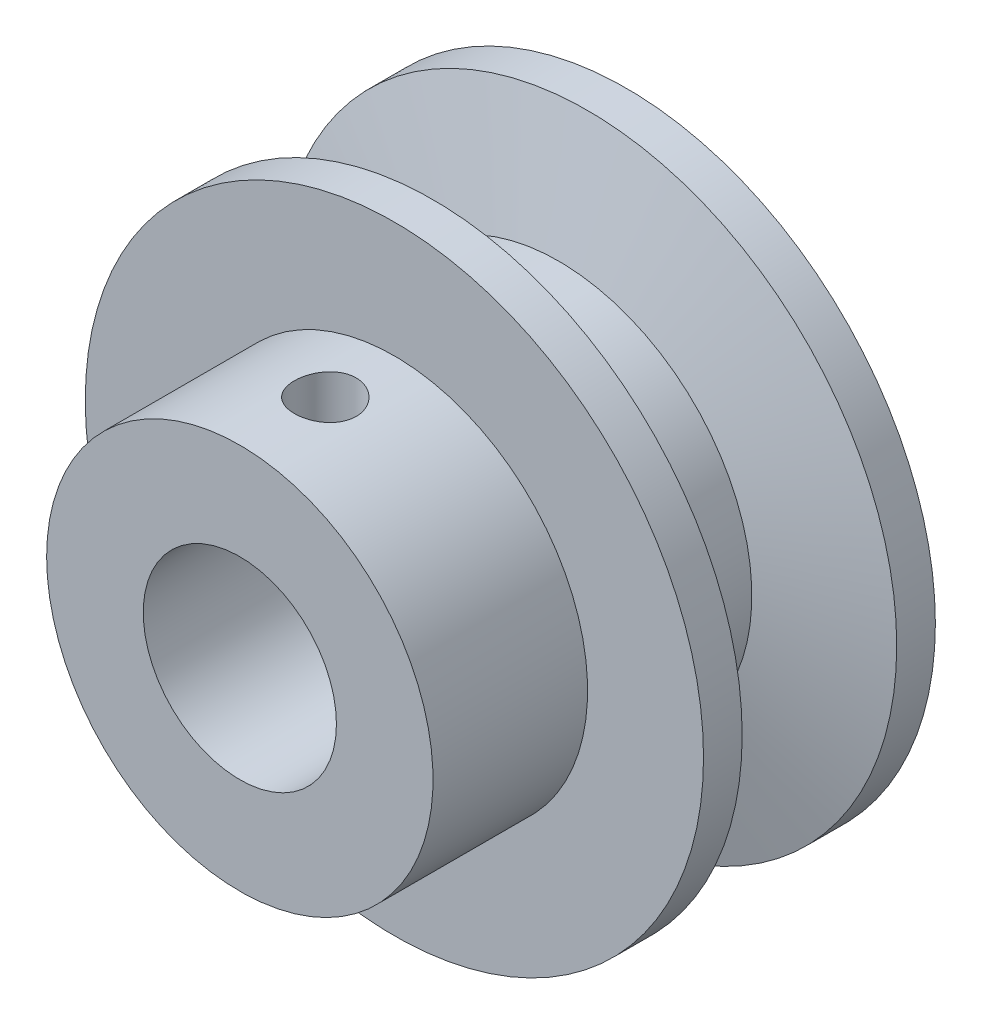
ISO-10303-21;
HEADER;
FILE_DESCRIPTION(('STEP AP214'),'2;1');
FILE_NAME('part.step','',(''),(''),'','','');
FILE_SCHEMA(('AUTOMOTIVE_DESIGN { 1 0 10303 214 1 1 1 1 }'));
ENDSEC;
DATA;
#1=APPLICATION_CONTEXT('core data for automotive mechanical design processes');
#2=APPLICATION_PROTOCOL_DEFINITION('international standard','automotive_design',2000,#1);
#3=PRODUCT_CONTEXT('',#1,'mechanical');
#4=PRODUCT('Part','Part','',(#3));
#5=PRODUCT_RELATED_PRODUCT_CATEGORY('part','',(#4));
#6=PRODUCT_DEFINITION_FORMATION('','',#4);
#7=PRODUCT_DEFINITION_CONTEXT('part definition',#1,'design');
#8=PRODUCT_DEFINITION('design','',#6,#7);
#9=PRODUCT_DEFINITION_SHAPE('','',#8);
#10=(LENGTH_UNIT() NAMED_UNIT(*) SI_UNIT(.MILLI.,.METRE.));
#11=(NAMED_UNIT(*) PLANE_ANGLE_UNIT() SI_UNIT($,.RADIAN.));
#12=(NAMED_UNIT(*) SI_UNIT($,.STERADIAN.) SOLID_ANGLE_UNIT());
#13=UNCERTAINTY_MEASURE_WITH_UNIT(LENGTH_MEASURE(1.E-05),#10,'distance_accuracy_value','');
#14=(GEOMETRIC_REPRESENTATION_CONTEXT(3) GLOBAL_UNCERTAINTY_ASSIGNED_CONTEXT((#13)) GLOBAL_UNIT_ASSIGNED_CONTEXT((#10,
#11,#12)) REPRESENTATION_CONTEXT('',''));
#15=CARTESIAN_POINT('',(0.,0.,0.));
#16=DIRECTION('',(0.,0.,1.));
#17=DIRECTION('',(1.,0.,0.));
#18=AXIS2_PLACEMENT_3D('',#15,#16,#17);
#19=CARTESIAN_POINT('',(0.,0.,-24.3039443155452));
#20=DIRECTION('',(0.,0.,1.));
#21=DIRECTION('',(1.,0.,0.));
#22=AXIS2_PLACEMENT_3D('',#19,#20,#21);
#23=PLANE('',#22);
#24=CARTESIAN_POINT('',(0.,0.,-24.3039443155452));
#25=DIRECTION('',(0.,0.,1.));
#26=DIRECTION('',(1.,0.,0.));
#27=AXIS2_PLACEMENT_3D('',#24,#25,#26);
#28=CIRCLE('',#27,12.5);
#29=CARTESIAN_POINT('',(12.5,0.,-24.3039443155452));
#30=VERTEX_POINT('',#29);
#31=EDGE_CURVE('E71',#30,#30,#28,.T.);
#32=ORIENTED_EDGE('',*,*,#31,.T.);
#33=EDGE_LOOP('',(#32));
#34=FACE_BOUND('',#33,.T.);
#35=CARTESIAN_POINT('',(0.,0.,-24.3039443155452));
#36=DIRECTION('',(0.,0.,-1.));
#37=DIRECTION('',(-1.,0.,0.));
#38=AXIS2_PLACEMENT_3D('',#35,#36,#37);
#39=CIRCLE('',#38,40.);
#40=CARTESIAN_POINT('',(-40.,0.,-24.3039443155452));
#41=VERTEX_POINT('',#40);
#42=EDGE_CURVE('E10',#41,#41,#39,.T.);
#43=ORIENTED_EDGE('',*,*,#42,.T.);
#44=EDGE_LOOP('',(#43));
#45=FACE_BOUND('',#44,.T.);
#46=ADVANCED_FACE('F35',(#34,#45),#23,.F.);
#47=CARTESIAN_POINT('',(0.,0.,-24.3039443155452));
#48=DIRECTION('',(0.,0.,-1.));
#49=DIRECTION('',(-1.,0.,0.));
#50=AXIS2_PLACEMENT_3D('',#47,#48,#49);
#51=CYLINDRICAL_SURFACE('',#50,40.);
#52=ORIENTED_EDGE('',*,*,#42,.F.);
#53=EDGE_LOOP('',(#52));
#54=FACE_BOUND('',#53,.T.);
#55=CARTESIAN_POINT('',(0.,0.,-19.3039443155452));
#56=DIRECTION('',(0.,0.,-1.));
#57=DIRECTION('',(-1.,0.,0.));
#58=AXIS2_PLACEMENT_3D('',#55,#56,#57);
#59=CIRCLE('',#58,40.);
#60=CARTESIAN_POINT('',(-40.,0.,-19.3039443155452));
#61=VERTEX_POINT('',#60);
#62=EDGE_CURVE('E47',#61,#61,#59,.T.);
#63=ORIENTED_EDGE('',*,*,#62,.T.);
#64=EDGE_LOOP('',(#63));
#65=FACE_BOUND('',#64,.T.);
#66=ADVANCED_FACE('F107',(#54,#65),#51,.T.);
#67=CARTESIAN_POINT('',(0.,0.,-15.5539443155452));
#68=DIRECTION('',(0.,0.,-1.));
#69=DIRECTION('',(-1.,0.,0.));
#70=AXIS2_PLACEMENT_3D('',#67,#68,#69);
#71=CONICAL_SURFACE('',#70,25.,1.32581766366803);
#72=ORIENTED_EDGE('',*,*,#62,.F.);
#73=EDGE_LOOP('',(#72));
#74=FACE_BOUND('',#73,.T.);
#75=CARTESIAN_POINT('',(0.,0.,-15.5539443155452));
#76=DIRECTION('',(0.,0.,-1.));
#77=DIRECTION('',(-1.,0.,0.));
#78=AXIS2_PLACEMENT_3D('',#75,#76,#77);
#79=CIRCLE('',#78,25.);
#80=CARTESIAN_POINT('',(-25.,0.,-15.5539443155452));
#81=VERTEX_POINT('',#80);
#82=EDGE_CURVE('E51',#81,#81,#79,.T.);
#83=ORIENTED_EDGE('',*,*,#82,.T.);
#84=EDGE_LOOP('',(#83));
#85=FACE_BOUND('',#84,.T.);
#86=ADVANCED_FACE('F112',(#74,#85),#71,.T.);
#87=CARTESIAN_POINT('',(0.,0.,-24.3039443155452));
#88=DIRECTION('',(0.,0.,-1.));
#89=DIRECTION('',(-1.,0.,0.));
#90=AXIS2_PLACEMENT_3D('',#87,#88,#89);
#91=CYLINDRICAL_SURFACE('',#90,25.);
#92=ORIENTED_EDGE('',*,*,#82,.F.);
#93=EDGE_LOOP('',(#92));
#94=FACE_BOUND('',#93,.T.);
#95=CARTESIAN_POINT('',(0.,0.,-3.05394431554524));
#96=DIRECTION('',(0.,0.,-1.));
#97=DIRECTION('',(-1.,0.,0.));
#98=AXIS2_PLACEMENT_3D('',#95,#96,#97);
#99=CIRCLE('',#98,25.);
#100=CARTESIAN_POINT('',(-25.,0.,-3.05394431554524));
#101=VERTEX_POINT('',#100);
#102=EDGE_CURVE('E56',#101,#101,#99,.T.);
#103=ORIENTED_EDGE('',*,*,#102,.T.);
#104=EDGE_LOOP('',(#103));
#105=FACE_BOUND('',#104,.T.);
#106=ADVANCED_FACE('F119',(#94,#105),#91,.T.);
#107=CARTESIAN_POINT('',(0.,0.,0.696055684454761));
#108=DIRECTION('',(0.,0.,1.));
#109=DIRECTION('',(1.,0.,0.));
#110=AXIS2_PLACEMENT_3D('',#107,#108,#109);
#111=CONICAL_SURFACE('',#110,40.,1.32581766366803);
#112=ORIENTED_EDGE('',*,*,#102,.F.);
#113=EDGE_LOOP('',(#112));
#114=FACE_BOUND('',#113,.T.);
#115=CARTESIAN_POINT('',(0.,0.,0.696055684454761));
#116=DIRECTION('',(0.,0.,-1.));
#117=DIRECTION('',(-1.,0.,0.));
#118=AXIS2_PLACEMENT_3D('',#115,#116,#117);
#119=CIRCLE('',#118,40.);
#120=CARTESIAN_POINT('',(-40.,0.,0.696055684454766));
#121=VERTEX_POINT('',#120);
#122=EDGE_CURVE('E59',#121,#121,#119,.T.);
#123=ORIENTED_EDGE('',*,*,#122,.T.);
#124=EDGE_LOOP('',(#123));
#125=FACE_BOUND('',#124,.T.);
#126=ADVANCED_FACE('F126',(#114,#125),#111,.T.);
#127=CARTESIAN_POINT('',(0.,0.,-24.3039443155452));
#128=DIRECTION('',(0.,0.,-1.));
#129=DIRECTION('',(-1.,0.,0.));
#130=AXIS2_PLACEMENT_3D('',#127,#128,#129);
#131=CYLINDRICAL_SURFACE('',#130,40.);
#132=ORIENTED_EDGE('',*,*,#122,.F.);
#133=EDGE_LOOP('',(#132));
#134=FACE_BOUND('',#133,.T.);
#135=CARTESIAN_POINT('',(0.,0.,5.69605568445476));
#136=DIRECTION('',(0.,0.,-1.));
#137=DIRECTION('',(-1.,0.,0.));
#138=AXIS2_PLACEMENT_3D('',#135,#136,#137);
#139=CIRCLE('',#138,40.);
#140=CARTESIAN_POINT('',(-40.,0.,5.69605568445477));
#141=VERTEX_POINT('',#140);
#142=EDGE_CURVE('E62',#141,#141,#139,.T.);
#143=ORIENTED_EDGE('',*,*,#142,.T.);
#144=EDGE_LOOP('',(#143));
#145=FACE_BOUND('',#144,.T.);
#146=ADVANCED_FACE('F130',(#134,#145),#131,.T.);
#147=CARTESIAN_POINT('',(40.,0.,5.69605568445476));
#148=DIRECTION('',(0.,0.,-1.));
#149=DIRECTION('',(-1.,0.,0.));
#150=AXIS2_PLACEMENT_3D('',#147,#148,#149);
#151=PLANE('',#150);
#152=ORIENTED_EDGE('',*,*,#142,.F.);
#153=EDGE_LOOP('',(#152));
#154=FACE_BOUND('',#153,.T.);
#155=CARTESIAN_POINT('',(0.,0.,5.69605568445476));
#156=DIRECTION('',(0.,0.,-1.));
#157=DIRECTION('',(-1.,0.,0.));
#158=AXIS2_PLACEMENT_3D('',#155,#156,#157);
#159=CIRCLE('',#158,25.);
#160=CARTESIAN_POINT('',(-25.,0.,5.69605568445477));
#161=VERTEX_POINT('',#160);
#162=EDGE_CURVE('E65',#161,#161,#159,.T.);
#163=ORIENTED_EDGE('',*,*,#162,.T.);
#164=EDGE_LOOP('',(#163));
#165=FACE_BOUND('',#164,.T.);
#166=ADVANCED_FACE('F102',(#154,#165),#151,.F.);
#167=CARTESIAN_POINT('',(0.,0.,-24.3039443155452));
#168=DIRECTION('',(0.,0.,-1.));
#169=DIRECTION('',(-1.,0.,0.));
#170=AXIS2_PLACEMENT_3D('',#167,#168,#169);
#171=CYLINDRICAL_SURFACE('',#170,25.);
#172=CARTESIAN_POINT('',(-4.,24.6779253585061,14.6377820226935));
#173=CARTESIAN_POINT('',(-3.99999092536538,24.6779292731493,14.4146485919543));
#174=CARTESIAN_POINT('',(-3.98126611040703,24.6809844341802,14.1913901409407));
#175=CARTESIAN_POINT('',(-3.9068889100177,24.6928650235043,13.7511283280042));
#176=CARTESIAN_POINT('',(-3.85120166039988,24.7016958995272,13.5341310736843));
#177=CARTESIAN_POINT('',(-3.70461945874254,24.7241027007214,13.112827396491));
#178=CARTESIAN_POINT('',(-3.61375293851779,24.7376747931882,12.908510879403));
#179=CARTESIAN_POINT('',(-3.39946083296861,24.7680302580012,12.5180490619166));
#180=CARTESIAN_POINT('',(-3.27603924790085,24.784813235735,12.3319015328217));
#181=CARTESIAN_POINT('',(-2.99894280472959,24.819870017184,11.9813441571029));
#182=CARTESIAN_POINT('',(-2.84502997415169,24.8381548393908,11.8171234916739));
#183=CARTESIAN_POINT('',(-2.51183419630463,24.8740570032156,11.5167231033732));
#184=CARTESIAN_POINT('',(-2.33254979194337,24.8916743064242,11.380544992092));
#185=CARTESIAN_POINT('',(-1.95247983405864,24.9243725216135,11.1393901001101));
#186=CARTESIAN_POINT('',(-1.75158168894769,24.9394389842577,11.0345886420173));
#187=CARTESIAN_POINT('',(-1.33475199178192,24.9652155524521,10.8602881445735));
#188=CARTESIAN_POINT('',(-1.11882134234493,24.9759259192977,10.7907869877121));
#189=CARTESIAN_POINT('',(-0.680008257892136,24.9917057633414,10.6896365339686));
#190=CARTESIAN_POINT('',(-0.457200726718815,24.9968225235199,10.6576697838833));
#191=CARTESIAN_POINT('',(-0.0093296150445047,25.0010009235319,10.6315090065221));
#192=CARTESIAN_POINT('',(0.21573382272602,25.0000629440624,10.6373126044036));
#193=CARTESIAN_POINT('',(0.659559431957061,24.9922751229404,10.6862789940635));
#194=CARTESIAN_POINT('',(0.878360374642828,24.9854793381704,10.7291001911881));
#195=CARTESIAN_POINT('',(1.30563068549535,24.9667997195147,10.8503490519428));
#196=CARTESIAN_POINT('',(1.51409975845636,24.9549157403409,10.9287777323123));
#197=CARTESIAN_POINT('',(1.91581197281808,24.9273026006901,11.1193589400937));
#198=CARTESIAN_POINT('',(2.10898658698767,24.9115573014927,11.2316534774851));
#199=CARTESIAN_POINT('',(2.47387934314066,24.8779731229889,11.4866748799275));
#200=CARTESIAN_POINT('',(2.64559588026693,24.8601340872846,11.6294040190351));
#201=CARTESIAN_POINT('',(2.96471443147071,24.8241131404317,11.943141149814));
#202=CARTESIAN_POINT('',(3.11182301643199,24.8059296259375,12.1144475743753));
#203=CARTESIAN_POINT('',(3.37525361654882,24.7714627701456,12.4794675352374));
#204=CARTESIAN_POINT('',(3.49157538912893,24.7551794438203,12.6731812480723));
#205=CARTESIAN_POINT('',(3.69018063254585,24.7263563099702,13.0778430426075));
#206=CARTESIAN_POINT('',(3.77243090843837,24.7138201565097,13.2888076930062));
#207=CARTESIAN_POINT('',(3.9002470802389,24.6939728783789,13.7218032659801));
#208=CARTESIAN_POINT('',(3.94581593839021,24.6866613317959,13.9438332934222));
#209=CARTESIAN_POINT('',(3.99856699995258,24.6781720983454,14.3900376680404));
#210=CARTESIAN_POINT('',(4.00616652749841,24.676927730288,14.6141614520622));
#211=CARTESIAN_POINT('',(3.98387335096491,24.6805363746112,15.0604799552248));
#212=CARTESIAN_POINT('',(3.95398197694092,24.6853891706843,15.2826747425185));
#213=CARTESIAN_POINT('',(3.85791055409721,24.7005838939959,15.7175158335823));
#214=CARTESIAN_POINT('',(3.79194106688481,24.7108939600193,15.930209869055));
#215=CARTESIAN_POINT('',(3.62580613822712,24.7358149947642,16.3415227967269));
#216=CARTESIAN_POINT('',(3.5256387965801,24.7504262024721,16.5401409060572));
#217=CARTESIAN_POINT('',(3.29295930434824,24.7824590360601,16.9195268088564));
#218=CARTESIAN_POINT('',(3.16017860187711,24.7999035665773,17.1001279298336));
#219=CARTESIAN_POINT('',(2.8664120849539,24.8355696830306,17.436634143967));
#220=CARTESIAN_POINT('',(2.70542444782833,24.8537913191241,17.5925376399736));
#221=CARTESIAN_POINT('',(2.35796950976243,24.8891684164148,17.8767366068792));
#222=CARTESIAN_POINT('',(2.17127376458598,24.9063120466622,18.0047544809151));
#223=CARTESIAN_POINT('',(1.77878369477711,24.9374141993437,18.2276081146705));
#224=CARTESIAN_POINT('',(1.57298994995265,24.951372818429,18.3224448813391));
#225=CARTESIAN_POINT('',(1.14898755418868,24.9744805999485,18.4758074707309));
#226=CARTESIAN_POINT('',(0.930833526197156,24.9836493338541,18.5344812351655));
#227=CARTESIAN_POINT('',(0.487610510439652,24.9962267816708,18.6143296954785));
#228=CARTESIAN_POINT('',(0.26254204651546,24.9996359308412,18.6355072250015));
#229=CARTESIAN_POINT('',(-0.185436321491424,25.0003046769524,18.639685618852));
#230=CARTESIAN_POINT('',(-0.408342289565951,24.9976324661082,18.6231098214993));
#231=CARTESIAN_POINT('',(-0.848152662274446,24.9865772449389,18.5531643461498));
#232=CARTESIAN_POINT('',(-1.06505709428051,24.9781942606641,18.4997948359923));
#233=CARTESIAN_POINT('',(-1.48656424622589,24.9566555788896,18.3579343730378));
#234=CARTESIAN_POINT('',(-1.69117840464935,24.943504401936,18.2694766785974));
#235=CARTESIAN_POINT('',(-2.08272639661099,24.9138685991873,18.0599971019357));
#236=CARTESIAN_POINT('',(-2.26965949895308,24.8973838356209,17.9389738737691));
#237=CARTESIAN_POINT('',(-2.62267778293662,24.8626909278472,17.6662853819247));
#238=CARTESIAN_POINT('',(-2.78852106637673,24.8444663732144,17.5143090167205));
#239=CARTESIAN_POINT('',(-3.09250238165525,24.8084646906746,17.1846822849662));
#240=CARTESIAN_POINT('',(-3.23063391295197,24.7906876686017,17.0070259112511));
#241=CARTESIAN_POINT('',(-3.47608383472304,24.7574701004892,16.6297236748555));
#242=CARTESIAN_POINT('',(-3.58319732214778,24.7420453966957,16.4299431221806));
#243=CARTESIAN_POINT('',(-3.76218364779547,24.7154654409001,16.0150654433668));
#244=CARTESIAN_POINT('',(-3.83409225684191,24.7043058577525,15.7999841196111));
#245=CARTESIAN_POINT('',(-3.92471971325528,24.6900374012308,15.4263061064522));
#246=CARTESIAN_POINT('',(-3.95290540227375,24.6855201523276,15.2699914357505));
#247=CARTESIAN_POINT('',(-3.99054862340905,24.679462762736,14.9550662335723));
#248=CARTESIAN_POINT('',(-4.00000645311638,24.6779225747413,14.7964557386173));
#249=CARTESIAN_POINT('',(-4.,24.6779253585061,14.6377820226935));
#250=B_SPLINE_CURVE_WITH_KNOTS('',3,(#172,#173,#174,#175,#176,#177,#178,#179,#180,#181,#182,
#183,#184,#185,#186,#187,#188,#189,#190,#191,#192,#193,#194,#195,#196,#197,#198,#199,#200,#201,
#202,#203,#204,#205,#206,#207,#208,#209,#210,#211,#212,#213,#214,#215,#216,#217,#218,#219,#220,
#221,#222,#223,#224,#225,#226,#227,#228,#229,#230,#231,#232,#233,#234,#235,#236,#237,#238,#239,
#240,#241,#242,#243,#244,#245,#246,#247,#248,#249),.UNSPECIFIED.,.T.,.F.,(4,2,2,2,2,2,2,2,2,2,2,
2,2,2,2,2,2,2,2,2,2,2,2,2,2,2,2,2,2,2,2,2,2,2,2,2,2,2,4),(0.,0.668820164924193,1.33827208126566,
2.00718407360898,2.67601391055897,3.3502853867162,4.02459560208042,4.70260619006599,
5.38057610236086,6.05276970225729,6.72492103782047,7.39093524697725,8.05696847476319,
8.72583436356141,9.39475024717232,10.0711476867558,10.7475504556511,11.4246106844065,
12.1016162310224,12.7711641266712,13.4406882696084,14.1063459542199,14.7720406320821,
15.4434123585964,16.1148274837665,16.7926485080713,17.4704489607171,18.1454578213466,
18.8204156684047,19.4878423409541,20.1552659689695,20.8220584849996,21.4888785640388,
22.1627644212778,22.8368081723264,23.5152080182644,24.1929171205326,24.6685332883235,
25.1441418983902),.UNSPECIFIED.);
#251=CARTESIAN_POINT('',(-4.,24.6779253585061,14.6377820226935));
#252=VERTEX_POINT('',#251);
#253=EDGE_CURVE('E77',#252,#252,#250,.T.);
#254=ORIENTED_EDGE('',*,*,#253,.T.);
#255=EDGE_LOOP('',(#254));
#256=FACE_BOUND('',#255,.T.);
#257=ORIENTED_EDGE('',*,*,#162,.F.);
#258=EDGE_LOOP('',(#257));
#259=FACE_BOUND('',#258,.T.);
#260=CARTESIAN_POINT('',(0.,0.,25.6960556844548));
#261=DIRECTION('',(0.,0.,-1.));
#262=DIRECTION('',(-1.,0.,0.));
#263=AXIS2_PLACEMENT_3D('',#260,#261,#262);
#264=CIRCLE('',#263,25.);
#265=CARTESIAN_POINT('',(-25.,0.,25.6960556844548));
#266=VERTEX_POINT('',#265);
#267=EDGE_CURVE('E68',#266,#266,#264,.T.);
#268=ORIENTED_EDGE('',*,*,#267,.T.);
#269=EDGE_LOOP('',(#268));
#270=FACE_BOUND('',#269,.T.);
#271=ADVANCED_FACE('F83',(#256,#259,#270),#171,.T.);
#272=CARTESIAN_POINT('',(25.,0.,25.6960556844548));
#273=DIRECTION('',(0.,0.,-1.));
#274=DIRECTION('',(-1.,0.,0.));
#275=AXIS2_PLACEMENT_3D('',#272,#273,#274);
#276=PLANE('',#275);
#277=CARTESIAN_POINT('',(0.,0.,25.6960556844548));
#278=DIRECTION('',(0.,0.,1.));
#279=DIRECTION('',(1.,0.,0.));
#280=AXIS2_PLACEMENT_3D('',#277,#278,#279);
#281=CIRCLE('',#280,12.5);
#282=CARTESIAN_POINT('',(12.5,0.,25.6960556844548));
#283=VERTEX_POINT('',#282);
#284=EDGE_CURVE('E74',#283,#283,#281,.T.);
#285=ORIENTED_EDGE('',*,*,#284,.F.);
#286=EDGE_LOOP('',(#285));
#287=FACE_BOUND('',#286,.T.);
#288=ORIENTED_EDGE('',*,*,#267,.F.);
#289=EDGE_LOOP('',(#288));
#290=FACE_BOUND('',#289,.T.);
#291=ADVANCED_FACE('F95',(#287,#290),#276,.F.);
#292=CARTESIAN_POINT('',(0.,0.,-44.3039443155452));
#293=DIRECTION('',(0.,0.,1.));
#294=DIRECTION('',(1.,0.,0.));
#295=AXIS2_PLACEMENT_3D('',#292,#293,#294);
#296=CYLINDRICAL_SURFACE('',#295,12.5);
#297=CARTESIAN_POINT('',(-4.,11.842719282327,14.6377820226935));
#298=CARTESIAN_POINT('',(-3.99999935935302,11.8427199699566,14.8561976176664));
#299=CARTESIAN_POINT('',(-3.98204982916322,11.8488277399487,15.0746207820799));
#300=CARTESIAN_POINT('',(-3.91094422931103,11.8724842974625,15.5050309917439));
#301=CARTESIAN_POINT('',(-3.85777999166795,11.8900357393061,15.7170165318671));
#302=CARTESIAN_POINT('',(-3.71827554706384,11.9343925365716,16.1282522767954));
#303=CARTESIAN_POINT('',(-3.63199625417291,11.9611808918508,16.3275250859487));
#304=CARTESIAN_POINT('',(-3.42891586136008,12.0209691387475,16.7088261252486));
#305=CARTESIAN_POINT('',(-3.3121088807135,12.0539702268166,16.8908510236152));
#306=CARTESIAN_POINT('',(-3.04678104882872,12.1237992191192,17.2390480105228));
#307=CARTESIAN_POINT('',(-2.89734836823299,12.1607169507637,17.4045074363804));
#308=CARTESIAN_POINT('',(-2.57296030582542,12.2334570053411,17.7084980873532));
#309=CARTESIAN_POINT('',(-2.39800118371827,12.269279166812,17.847025359249));
#310=CARTESIAN_POINT('',(-2.02237355615693,12.3368238271391,18.0963954859435));
#311=CARTESIAN_POINT('',(-1.82119171965248,12.3684282786178,18.2064998959666));
#312=CARTESIAN_POINT('',(-1.40198048377137,12.4229242661366,18.3910284326076));
#313=CARTESIAN_POINT('',(-1.18395526351671,12.4458179551613,18.4654613771002));
#314=CARTESIAN_POINT('',(-0.744711775297691,12.479676950379,18.5741414707644));
#315=CARTESIAN_POINT('',(-0.523823472185482,12.4910032748545,18.6096076668475));
#316=CARTESIAN_POINT('',(-0.0789603248012286,12.5017287029849,18.6432147864463));
#317=CARTESIAN_POINT('',(0.145013772077128,12.5011306457409,18.641364594698));
#318=CARTESIAN_POINT('',(0.581093729167385,12.4883236997896,18.6011832677626));
#319=CARTESIAN_POINT('',(0.793335790758781,12.4765357034484,18.564174528092));
#320=CARTESIAN_POINT('',(1.20842073412411,12.4431948493389,18.4569024645906));
#321=CARTESIAN_POINT('',(1.41126299248278,12.4216413449197,18.3866369385534));
#322=CARTESIAN_POINT('',(1.80478487403707,12.3706365500491,18.2140239413992));
#323=CARTESIAN_POINT('',(1.99527942968322,12.3410893332516,18.1112840687105));
#324=CARTESIAN_POINT('',(2.35672859352838,12.2771970855205,17.8769565054462));
#325=CARTESIAN_POINT('',(2.52767806251326,12.2428507979634,17.7453612540134));
#326=CARTESIAN_POINT('',(2.8530638131067,12.1712367294856,17.4503129183642));
#327=CARTESIAN_POINT('',(3.0064553444956,12.1339068619231,17.2857211150638));
#328=CARTESIAN_POINT('',(3.28378018395939,12.0618145989439,16.9328113702304));
#329=CARTESIAN_POINT('',(3.40770966195435,12.0270525377475,16.7444903487522));
#330=CARTESIAN_POINT('',(3.62388810953954,11.9637089339779,16.3463901720026));
#331=CARTESIAN_POINT('',(3.71573126088371,11.9352081440021,16.1363768344325));
#332=CARTESIAN_POINT('',(3.8624115437165,11.8885562852076,15.7027300068966));
#333=CARTESIAN_POINT('',(3.91726274260851,11.8704012824717,15.4791017297709));
#334=CARTESIAN_POINT('',(3.98634732980607,11.8473757948988,15.0346222474283));
#335=CARTESIAN_POINT('',(4.0021876938619,11.8419801089925,14.8140479018717));
#336=CARTESIAN_POINT('',(3.99732669767184,11.8436224693089,14.3733713463571));
#337=CARTESIAN_POINT('',(3.97663132425953,11.8506584784444,14.1532690649625));
#338=CARTESIAN_POINT('',(3.90072533361949,11.8758511036107,13.7268394543317));
#339=CARTESIAN_POINT('',(3.84659716428486,11.8936586123319,13.5202966559462));
#340=CARTESIAN_POINT('',(3.70664280725108,11.9380128770361,13.1192541233439));
#341=CARTESIAN_POINT('',(3.62081128645948,11.9645611032884,12.9247564217673));
#342=CARTESIAN_POINT('',(3.41697396012587,12.0243860591649,12.5469124047889));
#343=CARTESIAN_POINT('',(3.29808617389174,12.0578396098649,12.3640706256702));
#344=CARTESIAN_POINT('',(3.03252999413196,12.1273479833206,12.0203484672341));
#345=CARTESIAN_POINT('',(2.88585403708636,12.1634035126375,11.8594740876727));
#346=CARTESIAN_POINT('',(2.56125244512296,12.2359628130699,11.556984246108));
#347=CARTESIAN_POINT('',(2.3822399787251,12.2724171226716,11.4165200187342));
#348=CARTESIAN_POINT('',(2.00229721221567,12.3400966382304,11.1675693295017));
#349=CARTESIAN_POINT('',(1.80136784836229,12.3713220674134,11.0590815023898));
#350=CARTESIAN_POINT('',(1.38445940226065,12.4248572290492,10.8781920295242));
#351=CARTESIAN_POINT('',(1.16859881389167,12.4472294035216,10.8055367266591));
#352=CARTESIAN_POINT('',(0.726874957063002,12.480810616577,10.6978217624167));
#353=CARTESIAN_POINT('',(0.501015012458263,12.4920233359687,10.6627497043762));
#354=CARTESIAN_POINT('',(0.0562765879062591,12.5017663129826,10.6322427529441));
#355=CARTESIAN_POINT('',(-0.162477761236101,12.5008274477244,10.6351487351188));
#356=CARTESIAN_POINT('',(-0.596238594775701,12.4876568899275,10.6764747346391));
#357=CARTESIAN_POINT('',(-0.811245342941925,12.4754259954572,10.7148922421944));
#358=CARTESIAN_POINT('',(-1.22850760398064,12.4412233539435,10.8250776996084));
#359=CARTESIAN_POINT('',(-1.43089717143291,12.4193869374855,10.8963829538076));
#360=CARTESIAN_POINT('',(-1.82093134276042,12.3682230993078,11.0698985466242));
#361=CARTESIAN_POINT('',(-2.00857335487159,12.3388943647058,11.1721143022801));
#362=CARTESIAN_POINT('',(-2.37094464163666,12.2745138549376,11.408684792157));
#363=CARTESIAN_POINT('',(-2.54499113183174,12.2392975634481,11.5440401132045));
#364=CARTESIAN_POINT('',(-2.86844801950664,12.1675595998111,11.8413052122944));
#365=CARTESIAN_POINT('',(-3.01785084465771,12.1310375306124,12.0032231219287));
#366=CARTESIAN_POINT('',(-3.29310491309765,12.0592883124172,12.3558486367839));
#367=CARTESIAN_POINT('',(-3.41794102245579,12.0241521106559,12.5473695278721));
#368=CARTESIAN_POINT('',(-3.63353471705189,11.9607741956668,12.9497437868758));
#369=CARTESIAN_POINT('',(-3.72430441468119,11.9325300332104,13.1605902503003));
#370=CARTESIAN_POINT('',(-3.86354015966022,11.8881467072458,13.5802391254643));
#371=CARTESIAN_POINT('',(-3.91455627646292,11.8712893448615,13.7881199124078));
#372=CARTESIAN_POINT('',(-3.98278180434112,11.8485768271906,14.209926519741));
#373=CARTESIAN_POINT('',(-4.00000062749409,11.8427186088149,14.4238506403071));
#374=CARTESIAN_POINT('',(-4.,11.842719282327,14.6377820226935));
#375=B_SPLINE_CURVE_WITH_KNOTS('',3,(#297,#298,#299,#300,#301,#302,#303,#304,#305,#306,#307,
#308,#309,#310,#311,#312,#313,#314,#315,#316,#317,#318,#319,#320,#321,#322,#323,#324,#325,#326,
#327,#328,#329,#330,#331,#332,#333,#334,#335,#336,#337,#338,#339,#340,#341,#342,#343,#344,#345,
#346,#347,#348,#349,#350,#351,#352,#353,#354,#355,#356,#357,#358,#359,#360,#361,#362,#363,#364,
#365,#366,#367,#368,#369,#370,#371,#372,#373,#374),.UNSPECIFIED.,.T.,.F.,(4,2,2,2,2,2,2,2,2,2,2,
2,2,2,2,2,2,2,2,2,2,2,2,2,2,2,2,2,2,2,2,2,2,2,2,2,2,2,4),(0.,0.654455842715354,1.309063538331,
1.96247283098348,2.6160080865338,3.29090543042417,3.96590176403352,4.65698443727681,
5.34789618881213,6.01651686048925,6.68497834076492,7.32925318507044,7.9735706981002,
8.62599225189615,9.2785849617654,9.95962670810642,10.6407569418195,11.3302140454822,
12.0194088123989,12.6796997833962,13.3398825675735,13.979736408686,14.6196979341528,
15.2787163323882,15.9379143638459,16.6259668097989,17.3139898746478,17.9970699222358,
18.6799245895443,19.3330513205858,19.9861318951797,20.6302921470087,21.2745653528473,
21.9414122843778,22.6084637396799,23.2990150253329,23.9893205507533,24.6305185843684,
25.2715380278761),.UNSPECIFIED.);
#376=CARTESIAN_POINT('',(-4.,11.842719282327,14.6377820226935));
#377=VERTEX_POINT('',#376);
#378=EDGE_CURVE('E38',#377,#377,#375,.T.);
#379=ORIENTED_EDGE('',*,*,#378,.T.);
#380=EDGE_LOOP('',(#379));
#381=FACE_BOUND('',#380,.T.);
#382=ORIENTED_EDGE('',*,*,#284,.T.);
#383=EDGE_LOOP('',(#382));
#384=FACE_BOUND('',#383,.T.);
#385=ORIENTED_EDGE('',*,*,#31,.F.);
#386=EDGE_LOOP('',(#385));
#387=FACE_BOUND('',#386,.T.);
#388=ADVANCED_FACE('F90',(#381,#384,#387),#296,.F.);
#389=CARTESIAN_POINT('',(0.,-1.99999999999997,14.6377820226935));
#390=DIRECTION('',(0.,1.,0.));
#391=DIRECTION('',(-1.,0.,0.));
#392=AXIS2_PLACEMENT_3D('',#389,#390,#391);
#393=CYLINDRICAL_SURFACE('',#392,4.);
#394=ORIENTED_EDGE('',*,*,#378,.F.);
#395=EDGE_LOOP('',(#394));
#396=FACE_BOUND('',#395,.T.);
#397=ORIENTED_EDGE('',*,*,#253,.F.);
#398=EDGE_LOOP('',(#397));
#399=FACE_BOUND('',#398,.T.);
#400=ADVANCED_FACE('F87',(#396,#399),#393,.F.);
#401=CLOSED_SHELL('',(#46,#66,#86,#106,#126,#146,#166,#271,#291,#388,#400));
#402=MANIFOLD_SOLID_BREP('B2',#401);
#403=ADVANCED_BREP_SHAPE_REPRESENTATION('',(#18,#402),#14);
#404=SHAPE_DEFINITION_REPRESENTATION(#9,#403);
ENDSEC;
END-ISO-10303-21;
